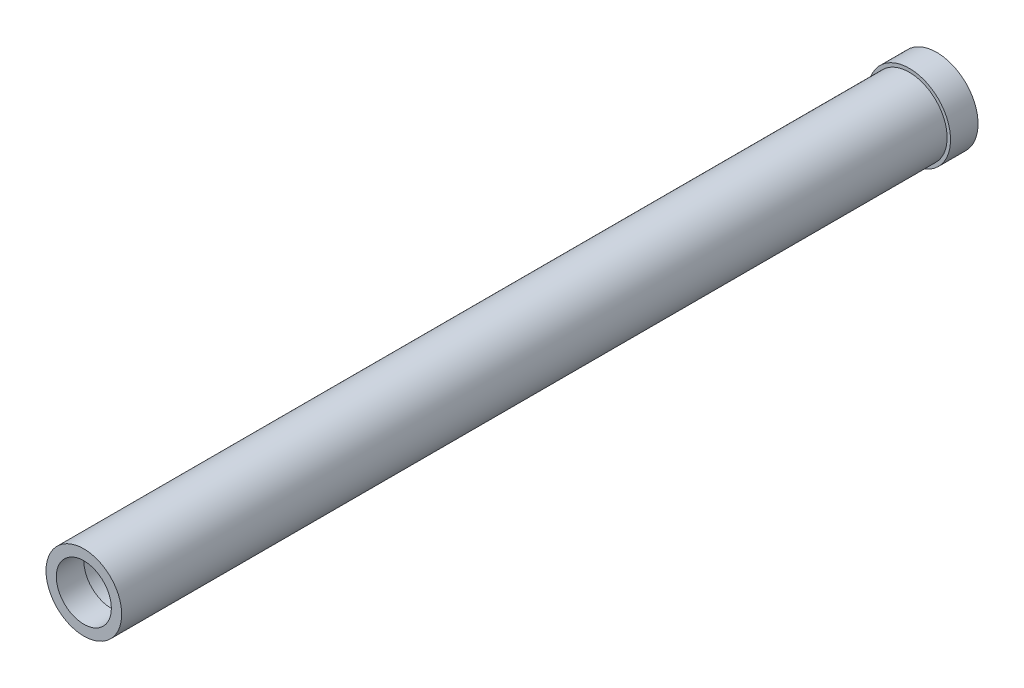
ISO-10303-21;
HEADER;
FILE_DESCRIPTION(('STEP AP214'),'2;1');
FILE_NAME('part.step','',(''),(''),'','','');
FILE_SCHEMA(('AUTOMOTIVE_DESIGN { 1 0 10303 214 1 1 1 1 }'));
ENDSEC;
DATA;
#1=APPLICATION_CONTEXT('core data for automotive mechanical design processes');
#2=APPLICATION_PROTOCOL_DEFINITION('international standard','automotive_design',2000,#1);
#3=PRODUCT_CONTEXT('',#1,'mechanical');
#4=PRODUCT('Part','Part','',(#3));
#5=PRODUCT_RELATED_PRODUCT_CATEGORY('part','',(#4));
#6=PRODUCT_DEFINITION_FORMATION('','',#4);
#7=PRODUCT_DEFINITION_CONTEXT('part definition',#1,'design');
#8=PRODUCT_DEFINITION('design','',#6,#7);
#9=PRODUCT_DEFINITION_SHAPE('','',#8);
#10=(LENGTH_UNIT() NAMED_UNIT(*) SI_UNIT(.MILLI.,.METRE.));
#11=(NAMED_UNIT(*) PLANE_ANGLE_UNIT() SI_UNIT($,.RADIAN.));
#12=(NAMED_UNIT(*) SI_UNIT($,.STERADIAN.) SOLID_ANGLE_UNIT());
#13=UNCERTAINTY_MEASURE_WITH_UNIT(LENGTH_MEASURE(1.E-05),#10,'distance_accuracy_value','');
#14=(GEOMETRIC_REPRESENTATION_CONTEXT(3) GLOBAL_UNCERTAINTY_ASSIGNED_CONTEXT((#13)) GLOBAL_UNIT_ASSIGNED_CONTEXT((#10,
#11,#12)) REPRESENTATION_CONTEXT('',''));
#15=CARTESIAN_POINT('',(0.,0.,0.));
#16=DIRECTION('',(0.,0.,1.));
#17=DIRECTION('',(1.,0.,0.));
#18=AXIS2_PLACEMENT_3D('',#15,#16,#17);
#19=CARTESIAN_POINT('',(0.,0.,76.2));
#20=DIRECTION('',(0.,0.,-1.));
#21=DIRECTION('',(-1.,0.,0.));
#22=AXIS2_PLACEMENT_3D('',#19,#20,#21);
#23=CYLINDRICAL_SURFACE('',#22,3.4925);
#24=CARTESIAN_POINT('',(0.,0.,78.74));
#25=DIRECTION('',(0.,0.,1.));
#26=DIRECTION('',(1.,0.,0.));
#27=AXIS2_PLACEMENT_3D('',#24,#25,#26);
#28=CIRCLE('',#27,3.4925);
#29=CARTESIAN_POINT('',(-3.4925,0.,78.74));
#30=VERTEX_POINT('',#29);
#31=EDGE_CURVE('E45',#30,#30,#28,.T.);
#32=CARTESIAN_POINT('',(0.,0.,2.54));
#33=DIRECTION('',(0.,0.,-1.));
#34=DIRECTION('',(-1.,0.,0.));
#35=AXIS2_PLACEMENT_3D('',#32,#33,#34);
#36=CIRCLE('',#35,3.4925);
#37=CARTESIAN_POINT('',(-3.4925,0.,2.54000000000001));
#38=VERTEX_POINT('',#37);
#39=EDGE_CURVE('E10',#38,#38,#36,.T.);
#40=CARTESIAN_POINT('',(-3.4925,0.,78.74));
#41=CARTESIAN_POINT('',(-3.4925,0.,77.94625));
#42=CARTESIAN_POINT('',(-3.4925,0.,77.1525));
#43=CARTESIAN_POINT('',(-3.4925,0.,75.565));
#44=CARTESIAN_POINT('',(-3.4925,0.,74.77125));
#45=CARTESIAN_POINT('',(-3.4925,0.,73.18375));
#46=CARTESIAN_POINT('',(-3.4925,0.,72.39));
#47=CARTESIAN_POINT('',(-3.4925,0.,70.8025));
#48=CARTESIAN_POINT('',(-3.4925,0.,70.00875));
#49=CARTESIAN_POINT('',(-3.4925,0.,68.42125));
#50=CARTESIAN_POINT('',(-3.4925,0.,67.6275));
#51=CARTESIAN_POINT('',(-3.4925,0.,66.04));
#52=CARTESIAN_POINT('',(-3.4925,0.,65.24625));
#53=CARTESIAN_POINT('',(-3.4925,0.,63.65875));
#54=CARTESIAN_POINT('',(-3.4925,0.,62.865));
#55=CARTESIAN_POINT('',(-3.4925,0.,61.2775));
#56=CARTESIAN_POINT('',(-3.4925,0.,60.48375));
#57=CARTESIAN_POINT('',(-3.4925,0.,58.89625));
#58=CARTESIAN_POINT('',(-3.4925,0.,58.1025));
#59=CARTESIAN_POINT('',(-3.4925,0.,56.515));
#60=CARTESIAN_POINT('',(-3.4925,0.,55.72125));
#61=CARTESIAN_POINT('',(-3.4925,0.,54.13375));
#62=CARTESIAN_POINT('',(-3.4925,0.,53.34));
#63=CARTESIAN_POINT('',(-3.4925,0.,51.7525));
#64=CARTESIAN_POINT('',(-3.4925,0.,50.95875));
#65=CARTESIAN_POINT('',(-3.4925,0.,49.37125));
#66=CARTESIAN_POINT('',(-3.4925,0.,48.5775));
#67=CARTESIAN_POINT('',(-3.4925,0.,46.99));
#68=CARTESIAN_POINT('',(-3.4925,0.,46.19625));
#69=CARTESIAN_POINT('',(-3.4925,0.,44.60875));
#70=CARTESIAN_POINT('',(-3.4925,0.,43.815));
#71=CARTESIAN_POINT('',(-3.4925,0.,42.2275));
#72=CARTESIAN_POINT('',(-3.4925,0.,41.43375));
#73=CARTESIAN_POINT('',(-3.4925,0.,39.84625));
#74=CARTESIAN_POINT('',(-3.4925,0.,39.0525));
#75=CARTESIAN_POINT('',(-3.4925,0.,37.465));
#76=CARTESIAN_POINT('',(-3.4925,0.,36.67125));
#77=CARTESIAN_POINT('',(-3.4925,0.,35.08375));
#78=CARTESIAN_POINT('',(-3.4925,0.,34.29));
#79=CARTESIAN_POINT('',(-3.4925,0.,32.7025));
#80=CARTESIAN_POINT('',(-3.4925,0.,31.90875));
#81=CARTESIAN_POINT('',(-3.4925,0.,30.32125));
#82=CARTESIAN_POINT('',(-3.4925,0.,29.5275));
#83=CARTESIAN_POINT('',(-3.4925,0.,27.94));
#84=CARTESIAN_POINT('',(-3.4925,0.,27.14625));
#85=CARTESIAN_POINT('',(-3.4925,0.,25.55875));
#86=CARTESIAN_POINT('',(-3.4925,0.,24.765));
#87=CARTESIAN_POINT('',(-3.4925,0.,23.1775));
#88=CARTESIAN_POINT('',(-3.4925,0.,22.38375));
#89=CARTESIAN_POINT('',(-3.4925,0.,20.79625));
#90=CARTESIAN_POINT('',(-3.4925,0.,20.0025));
#91=CARTESIAN_POINT('',(-3.4925,0.,18.415));
#92=CARTESIAN_POINT('',(-3.4925,0.,17.62125));
#93=CARTESIAN_POINT('',(-3.4925,0.,16.03375));
#94=CARTESIAN_POINT('',(-3.4925,0.,15.24));
#95=CARTESIAN_POINT('',(-3.4925,0.,13.6525));
#96=CARTESIAN_POINT('',(-3.4925,0.,12.85875));
#97=CARTESIAN_POINT('',(-3.4925,0.,11.27125));
#98=CARTESIAN_POINT('',(-3.4925,0.,10.4775));
#99=CARTESIAN_POINT('',(-3.4925,0.,8.89000000000002));
#100=CARTESIAN_POINT('',(-3.4925,0.,8.09625000000002));
#101=CARTESIAN_POINT('',(-3.4925,0.,6.50875000000002));
#102=CARTESIAN_POINT('',(-3.4925,0.,5.71500000000002));
#103=CARTESIAN_POINT('',(-3.4925,0.,4.12750000000002));
#104=CARTESIAN_POINT('',(-3.4925,0.,3.33375000000001));
#105=CARTESIAN_POINT('',(-3.4925,0.,2.54000000000001));
#106=B_SPLINE_CURVE_WITH_KNOTS('',3,(#40,#41,#42,#43,#44,#45,#46,#47,#48,#49,#50,#51,#52,#53,
#54,#55,#56,#57,#58,#59,#60,#61,#62,#63,#64,#65,#66,#67,#68,#69,#70,#71,#72,#73,#74,#75,#76,#77,
#78,#79,#80,#81,#82,#83,#84,#85,#86,#87,#88,#89,#90,#91,#92,#93,#94,#95,#96,#97,#98,#99,#100,
#101,#102,#103,#104,#105),.UNSPECIFIED.,.F.,.F.,(4,2,2,2,2,2,2,2,2,2,2,2,2,2,2,2,2,2,2,2,2,2,2,
2,2,2,2,2,2,2,2,2,4),(0.,2.38124999999999,4.76249999999999,7.14374999999999,9.52499999999999,
11.90625,14.2875,16.66875,19.05,21.43125,23.8125,26.19375,28.575,30.95625,33.3375,35.71875,38.1,
40.48125,42.8625,45.24375,47.625,50.00625,52.3875,54.76875,57.15,59.53125,61.9125,64.29375,
66.675,69.05625,71.4375,73.81875,76.2),.UNSPECIFIED.);
#107=EDGE_CURVE('BSEAM31',#30,#38,#106,.T.);
#108=ORIENTED_EDGE('',*,*,#31,.F.);
#109=ORIENTED_EDGE('',*,*,#39,.F.);
#110=ORIENTED_EDGE('',*,*,#107,.T.);
#111=ORIENTED_EDGE('',*,*,#107,.F.);
#112=EDGE_LOOP('',(#108,#110,#109,#111));
#113=FACE_BOUND('',#112,.T.);
#114=ADVANCED_FACE('F31',(#113),#23,.T.);
#115=CARTESIAN_POINT('',(0.,0.,0.));
#116=DIRECTION('',(0.,0.,1.));
#117=DIRECTION('',(1.,0.,0.));
#118=AXIS2_PLACEMENT_3D('',#115,#116,#117);
#119=PLANE('',#118);
#120=CARTESIAN_POINT('',(0.,0.,0.));
#121=DIRECTION('',(0.,0.,1.));
#122=DIRECTION('',(1.,0.,0.));
#123=AXIS2_PLACEMENT_3D('',#120,#121,#122);
#124=CIRCLE('',#123,2.8575);
#125=CARTESIAN_POINT('',(-2.8575,0.,0.));
#126=VERTEX_POINT('',#125);
#127=EDGE_CURVE('E37',#126,#126,#124,.T.);
#128=ORIENTED_EDGE('',*,*,#127,.T.);
#129=EDGE_LOOP('',(#128));
#130=FACE_BOUND('',#129,.T.);
#131=CARTESIAN_POINT('',(0.,0.,0.));
#132=DIRECTION('',(0.,0.,-1.));
#133=DIRECTION('',(-1.,0.,0.));
#134=AXIS2_PLACEMENT_3D('',#131,#132,#133);
#135=CIRCLE('',#134,3.81);
#136=CARTESIAN_POINT('',(-3.81,0.,0.));
#137=VERTEX_POINT('',#136);
#138=EDGE_CURVE('E57',#137,#137,#135,.T.);
#139=ORIENTED_EDGE('',*,*,#138,.T.);
#140=EDGE_LOOP('',(#139));
#141=FACE_BOUND('',#140,.T.);
#142=ADVANCED_FACE('F75',(#130,#141),#119,.F.);
#143=CARTESIAN_POINT('',(0.,0.,76.2));
#144=DIRECTION('',(0.,0.,-1.));
#145=DIRECTION('',(-1.,0.,0.));
#146=AXIS2_PLACEMENT_3D('',#143,#144,#145);
#147=CYLINDRICAL_SURFACE('',#146,2.8575);
#148=CARTESIAN_POINT('',(0.,0.,76.2));
#149=DIRECTION('',(0.,0.,1.));
#150=DIRECTION('',(1.,0.,0.));
#151=AXIS2_PLACEMENT_3D('',#148,#149,#150);
#152=CIRCLE('',#151,2.8575);
#153=CARTESIAN_POINT('',(-2.8575,0.,76.2));
#154=VERTEX_POINT('',#153);
#155=EDGE_CURVE('E41',#154,#154,#152,.T.);
#156=CARTESIAN_POINT('',(-2.8575,0.,76.2));
#157=CARTESIAN_POINT('',(-2.8575,0.,75.40625));
#158=CARTESIAN_POINT('',(-2.8575,0.,74.6125));
#159=CARTESIAN_POINT('',(-2.8575,0.,73.025));
#160=CARTESIAN_POINT('',(-2.8575,0.,72.23125));
#161=CARTESIAN_POINT('',(-2.8575,0.,70.64375));
#162=CARTESIAN_POINT('',(-2.8575,0.,69.85));
#163=CARTESIAN_POINT('',(-2.8575,0.,68.2625));
#164=CARTESIAN_POINT('',(-2.8575,0.,67.46875));
#165=CARTESIAN_POINT('',(-2.8575,0.,65.88125));
#166=CARTESIAN_POINT('',(-2.8575,0.,65.0875));
#167=CARTESIAN_POINT('',(-2.8575,0.,63.5));
#168=CARTESIAN_POINT('',(-2.8575,0.,62.70625));
#169=CARTESIAN_POINT('',(-2.8575,0.,61.11875));
#170=CARTESIAN_POINT('',(-2.8575,0.,60.325));
#171=CARTESIAN_POINT('',(-2.8575,0.,58.7375));
#172=CARTESIAN_POINT('',(-2.8575,0.,57.94375));
#173=CARTESIAN_POINT('',(-2.8575,0.,56.35625));
#174=CARTESIAN_POINT('',(-2.8575,0.,55.5625));
#175=CARTESIAN_POINT('',(-2.8575,0.,53.975));
#176=CARTESIAN_POINT('',(-2.8575,0.,53.18125));
#177=CARTESIAN_POINT('',(-2.8575,0.,51.59375));
#178=CARTESIAN_POINT('',(-2.8575,0.,50.8));
#179=CARTESIAN_POINT('',(-2.8575,0.,49.2125));
#180=CARTESIAN_POINT('',(-2.8575,0.,48.41875));
#181=CARTESIAN_POINT('',(-2.8575,0.,46.83125));
#182=CARTESIAN_POINT('',(-2.8575,0.,46.0375));
#183=CARTESIAN_POINT('',(-2.8575,0.,44.45));
#184=CARTESIAN_POINT('',(-2.8575,0.,43.65625));
#185=CARTESIAN_POINT('',(-2.8575,0.,42.06875));
#186=CARTESIAN_POINT('',(-2.8575,0.,41.275));
#187=CARTESIAN_POINT('',(-2.8575,0.,39.6875));
#188=CARTESIAN_POINT('',(-2.8575,0.,38.89375));
#189=CARTESIAN_POINT('',(-2.8575,0.,37.30625));
#190=CARTESIAN_POINT('',(-2.8575,0.,36.5125));
#191=CARTESIAN_POINT('',(-2.8575,0.,34.925));
#192=CARTESIAN_POINT('',(-2.8575,0.,34.13125));
#193=CARTESIAN_POINT('',(-2.8575,0.,32.54375));
#194=CARTESIAN_POINT('',(-2.8575,0.,31.75));
#195=CARTESIAN_POINT('',(-2.8575,0.,30.1625));
#196=CARTESIAN_POINT('',(-2.8575,0.,29.36875));
#197=CARTESIAN_POINT('',(-2.8575,0.,27.78125));
#198=CARTESIAN_POINT('',(-2.8575,0.,26.9875));
#199=CARTESIAN_POINT('',(-2.8575,0.,25.4));
#200=CARTESIAN_POINT('',(-2.8575,0.,24.60625));
#201=CARTESIAN_POINT('',(-2.8575,0.,23.01875));
#202=CARTESIAN_POINT('',(-2.8575,0.,22.225));
#203=CARTESIAN_POINT('',(-2.8575,0.,20.6375));
#204=CARTESIAN_POINT('',(-2.8575,0.,19.84375));
#205=CARTESIAN_POINT('',(-2.8575,0.,18.25625));
#206=CARTESIAN_POINT('',(-2.8575,0.,17.4625));
#207=CARTESIAN_POINT('',(-2.8575,0.,15.875));
#208=CARTESIAN_POINT('',(-2.8575,0.,15.08125));
#209=CARTESIAN_POINT('',(-2.8575,0.,13.49375));
#210=CARTESIAN_POINT('',(-2.8575,0.,12.7));
#211=CARTESIAN_POINT('',(-2.8575,0.,11.1125));
#212=CARTESIAN_POINT('',(-2.8575,0.,10.31875));
#213=CARTESIAN_POINT('',(-2.8575,0.,8.73125));
#214=CARTESIAN_POINT('',(-2.8575,0.,7.93750000000001));
#215=CARTESIAN_POINT('',(-2.8575,0.,6.35));
#216=CARTESIAN_POINT('',(-2.8575,0.,5.55625));
#217=CARTESIAN_POINT('',(-2.8575,0.,3.96875));
#218=CARTESIAN_POINT('',(-2.8575,0.,3.175));
#219=CARTESIAN_POINT('',(-2.8575,0.,1.5875));
#220=CARTESIAN_POINT('',(-2.8575,0.,0.793750000000001));
#221=CARTESIAN_POINT('',(-2.8575,0.,0.));
#222=B_SPLINE_CURVE_WITH_KNOTS('',3,(#156,#157,#158,#159,#160,#161,#162,#163,#164,#165,#166,
#167,#168,#169,#170,#171,#172,#173,#174,#175,#176,#177,#178,#179,#180,#181,#182,#183,#184,#185,
#186,#187,#188,#189,#190,#191,#192,#193,#194,#195,#196,#197,#198,#199,#200,#201,#202,#203,#204,
#205,#206,#207,#208,#209,#210,#211,#212,#213,#214,#215,#216,#217,#218,#219,#220,#221),
.UNSPECIFIED.,.F.,.F.,(4,2,2,2,2,2,2,2,2,2,2,2,2,2,2,2,2,2,2,2,2,2,2,2,2,2,2,2,2,2,2,2,4),(0.,
2.38125,4.7625,7.14375,9.52500000000001,11.90625,14.2875,16.66875,19.05,21.43125,23.8125,
26.19375,28.575,30.95625,33.3375,35.71875,38.1,40.48125,42.8625,45.24375,47.625,50.00625,
52.3875,54.76875,57.15,59.53125,61.9125,64.29375,66.675,69.05625,71.4375,73.81875,76.2),.UNSPECIFIED.);
#223=EDGE_CURVE('BSEAM82',#154,#126,#222,.T.);
#224=ORIENTED_EDGE('',*,*,#155,.T.);
#225=ORIENTED_EDGE('',*,*,#127,.F.);
#226=ORIENTED_EDGE('',*,*,#223,.T.);
#227=ORIENTED_EDGE('',*,*,#223,.F.);
#228=EDGE_LOOP('',(#224,#226,#225,#227));
#229=FACE_BOUND('',#228,.T.);
#230=ADVANCED_FACE('F82',(#229),#147,.F.);
#231=CARTESIAN_POINT('',(0.,0.,76.2));
#232=DIRECTION('',(0.,0.,1.));
#233=DIRECTION('',(1.,0.,0.));
#234=AXIS2_PLACEMENT_3D('',#231,#232,#233);
#235=PLANE('',#234);
#236=CARTESIAN_POINT('',(0.,0.,76.2));
#237=DIRECTION('',(0.,0.,1.));
#238=DIRECTION('',(1.,0.,0.));
#239=AXIS2_PLACEMENT_3D('',#236,#237,#238);
#240=CIRCLE('',#239,2.54);
#241=CARTESIAN_POINT('',(2.54,0.,76.2));
#242=VERTEX_POINT('',#241);
#243=EDGE_CURVE('E51',#242,#242,#240,.T.);
#244=ORIENTED_EDGE('',*,*,#243,.T.);
#245=EDGE_LOOP('',(#244));
#246=FACE_BOUND('',#245,.T.);
#247=ORIENTED_EDGE('',*,*,#155,.F.);
#248=EDGE_LOOP('',(#247));
#249=FACE_BOUND('',#248,.T.);
#250=ADVANCED_FACE('F89',(#246,#249),#235,.F.);
#251=CARTESIAN_POINT('',(0.,0.,78.74));
#252=DIRECTION('',(0.,0.,1.));
#253=DIRECTION('',(1.,0.,0.));
#254=AXIS2_PLACEMENT_3D('',#251,#252,#253);
#255=PLANE('',#254);
#256=ORIENTED_EDGE('',*,*,#31,.T.);
#257=EDGE_LOOP('',(#256));
#258=FACE_BOUND('',#257,.T.);
#259=CARTESIAN_POINT('',(0.,0.,78.74));
#260=DIRECTION('',(0.,0.,1.));
#261=DIRECTION('',(1.,0.,0.));
#262=AXIS2_PLACEMENT_3D('',#259,#260,#261);
#263=CIRCLE('',#262,2.54);
#264=CARTESIAN_POINT('',(2.54,0.,78.74));
#265=VERTEX_POINT('',#264);
#266=EDGE_CURVE('E50',#265,#265,#263,.T.);
#267=ORIENTED_EDGE('',*,*,#266,.F.);
#268=EDGE_LOOP('',(#267));
#269=FACE_BOUND('',#268,.T.);
#270=ADVANCED_FACE('F86',(#258,#269),#255,.T.);
#271=CARTESIAN_POINT('',(0.,0.,78.74));
#272=DIRECTION('',(0.,0.,-1.));
#273=DIRECTION('',(-1.,0.,0.));
#274=AXIS2_PLACEMENT_3D('',#271,#272,#273);
#275=CYLINDRICAL_SURFACE('',#274,2.54);
#276=ORIENTED_EDGE('',*,*,#266,.T.);
#277=EDGE_LOOP('',(#276));
#278=FACE_BOUND('',#277,.T.);
#279=ORIENTED_EDGE('',*,*,#243,.F.);
#280=EDGE_LOOP('',(#279));
#281=FACE_BOUND('',#280,.T.);
#282=ADVANCED_FACE('F72',(#278,#281),#275,.F.);
#283=CARTESIAN_POINT('',(0.,0.,2.54));
#284=DIRECTION('',(0.,0.,-1.));
#285=DIRECTION('',(-1.,0.,0.));
#286=AXIS2_PLACEMENT_3D('',#283,#284,#285);
#287=CYLINDRICAL_SURFACE('',#286,3.81);
#288=CARTESIAN_POINT('',(0.,0.,2.54));
#289=DIRECTION('',(0.,0.,-1.));
#290=DIRECTION('',(-1.,0.,0.));
#291=AXIS2_PLACEMENT_3D('',#288,#289,#290);
#292=CIRCLE('',#291,3.81);
#293=CARTESIAN_POINT('',(-3.81,0.,2.54));
#294=VERTEX_POINT('',#293);
#295=EDGE_CURVE('E54',#294,#294,#292,.T.);
#296=ORIENTED_EDGE('',*,*,#295,.T.);
#297=EDGE_LOOP('',(#296));
#298=FACE_BOUND('',#297,.T.);
#299=ORIENTED_EDGE('',*,*,#138,.F.);
#300=EDGE_LOOP('',(#299));
#301=FACE_BOUND('',#300,.T.);
#302=ADVANCED_FACE('F63',(#298,#301),#287,.T.);
#303=CARTESIAN_POINT('',(0.,0.,2.54));
#304=DIRECTION('',(0.,0.,-1.));
#305=DIRECTION('',(-1.,0.,0.));
#306=AXIS2_PLACEMENT_3D('',#303,#304,#305);
#307=PLANE('',#306);
#308=ORIENTED_EDGE('',*,*,#39,.T.);
#309=EDGE_LOOP('',(#308));
#310=FACE_BOUND('',#309,.T.);
#311=ORIENTED_EDGE('',*,*,#295,.F.);
#312=EDGE_LOOP('',(#311));
#313=FACE_BOUND('',#312,.T.);
#314=ADVANCED_FACE('F66',(#310,#313),#307,.F.);
#315=CLOSED_SHELL('',(#114,#142,#230,#250,#270,#282,#302,#314));
#316=MANIFOLD_SOLID_BREP('B2',#315);
#317=ADVANCED_BREP_SHAPE_REPRESENTATION('',(#18,#316),#14);
#318=SHAPE_DEFINITION_REPRESENTATION(#9,#317);
ENDSEC;
END-ISO-10303-21;
